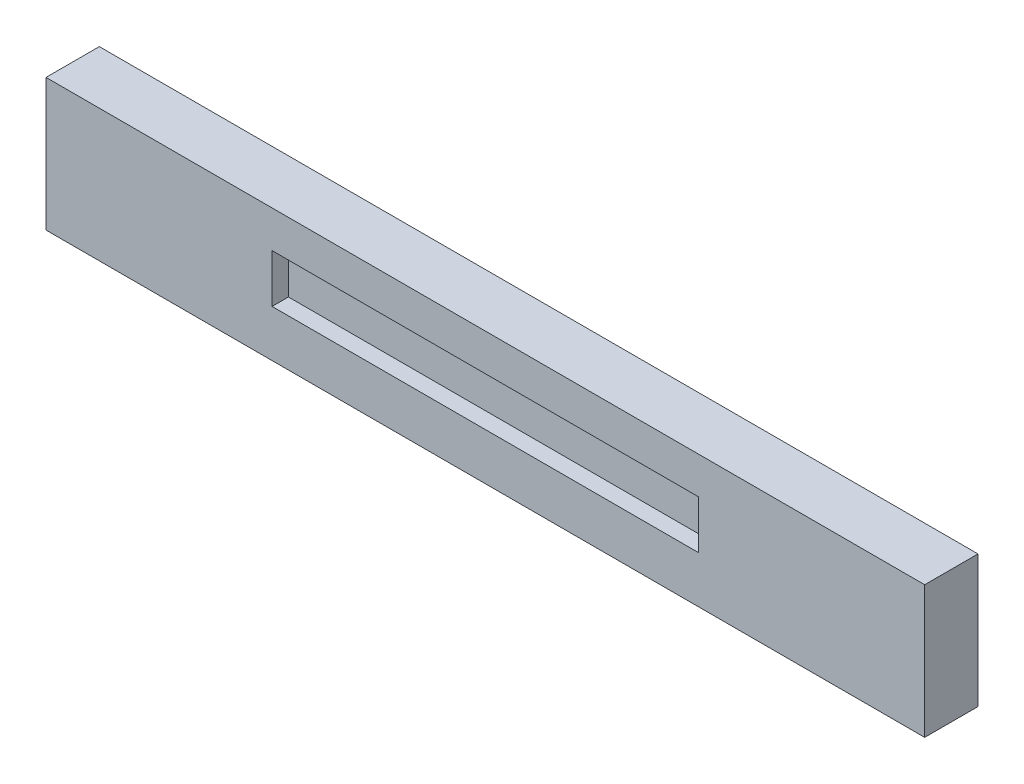
ISO-10303-21;
HEADER;
FILE_DESCRIPTION(('STEP AP214'),'2;1');
FILE_NAME('part.step','',(''),(''),'','','');
FILE_SCHEMA(('AUTOMOTIVE_DESIGN { 1 0 10303 214 1 1 1 1 }'));
ENDSEC;
DATA;
#1=APPLICATION_CONTEXT('core data for automotive mechanical design processes');
#2=APPLICATION_PROTOCOL_DEFINITION('international standard','automotive_design',2000,#1);
#3=PRODUCT_CONTEXT('',#1,'mechanical');
#4=PRODUCT('Part','Part','',(#3));
#5=PRODUCT_RELATED_PRODUCT_CATEGORY('part','',(#4));
#6=PRODUCT_DEFINITION_FORMATION('','',#4);
#7=PRODUCT_DEFINITION_CONTEXT('part definition',#1,'design');
#8=PRODUCT_DEFINITION('design','',#6,#7);
#9=PRODUCT_DEFINITION_SHAPE('','',#8);
#10=(LENGTH_UNIT() NAMED_UNIT(*) SI_UNIT(.MILLI.,.METRE.));
#11=(NAMED_UNIT(*) PLANE_ANGLE_UNIT() SI_UNIT($,.RADIAN.));
#12=(NAMED_UNIT(*) SI_UNIT($,.STERADIAN.) SOLID_ANGLE_UNIT());
#13=UNCERTAINTY_MEASURE_WITH_UNIT(LENGTH_MEASURE(1.E-05),#10,'distance_accuracy_value','');
#14=(GEOMETRIC_REPRESENTATION_CONTEXT(3) GLOBAL_UNCERTAINTY_ASSIGNED_CONTEXT((#13)) GLOBAL_UNIT_ASSIGNED_CONTEXT((#10,
#11,#12)) REPRESENTATION_CONTEXT('',''));
#15=CARTESIAN_POINT('',(0.,0.,0.));
#16=DIRECTION('',(0.,0.,1.));
#17=DIRECTION('',(1.,0.,0.));
#18=AXIS2_PLACEMENT_3D('',#15,#16,#17);
#19=CARTESIAN_POINT('',(0.,0.,38.5));
#20=DIRECTION('',(0.,0.,-1.));
#21=DIRECTION('',(-1.,0.,0.));
#22=AXIS2_PLACEMENT_3D('',#19,#20,#21);
#23=PLANE('',#22);
#24=DIRECTION('',(0.,-1.,0.));
#25=VECTOR('',#24,1.);
#26=CARTESIAN_POINT('',(0.,0.,38.5));
#27=LINE('',#26,#25);
#28=CARTESIAN_POINT('',(0.,93.,38.5));
#29=VERTEX_POINT('',#28);
#30=CARTESIAN_POINT('',(0.,0.,38.5));
#31=VERTEX_POINT('',#30);
#32=EDGE_CURVE('E145',#29,#31,#27,.T.);
#33=ORIENTED_EDGE('',*,*,#32,.T.);
#34=DIRECTION('',(1.,0.,0.));
#35=VECTOR('',#34,1.);
#36=CARTESIAN_POINT('',(0.,0.,38.5));
#37=LINE('',#36,#35);
#38=CARTESIAN_POINT('',(618.,0.,38.5));
#39=VERTEX_POINT('',#38);
#40=EDGE_CURVE('E92',#31,#39,#37,.T.);
#41=ORIENTED_EDGE('',*,*,#40,.T.);
#42=DIRECTION('',(0.,1.,0.));
#43=VECTOR('',#42,1.);
#44=CARTESIAN_POINT('',(618.,0.,38.5));
#45=LINE('',#44,#43);
#46=CARTESIAN_POINT('',(618.,93.,38.5));
#47=VERTEX_POINT('',#46);
#48=EDGE_CURVE('E148',#39,#47,#45,.T.);
#49=ORIENTED_EDGE('',*,*,#48,.T.);
#50=DIRECTION('',(-1.,0.,0.));
#51=VECTOR('',#50,1.);
#52=CARTESIAN_POINT('',(0.,93.,38.5));
#53=LINE('',#52,#51);
#54=EDGE_CURVE('E63',#47,#29,#53,.T.);
#55=ORIENTED_EDGE('',*,*,#54,.T.);
#56=EDGE_LOOP('',(#33,#41,#49,#55));
#57=FACE_BOUND('',#56,.T.);
#58=DIRECTION('',(0.,-1.,0.));
#59=VECTOR('',#58,1.);
#60=CARTESIAN_POINT('',(159.,0.,38.5));
#61=LINE('',#60,#59);
#62=CARTESIAN_POINT('',(159.,67.,38.5));
#63=VERTEX_POINT('',#62);
#64=CARTESIAN_POINT('',(159.,33.,38.5));
#65=VERTEX_POINT('',#64);
#66=EDGE_CURVE('E11',#63,#65,#61,.T.);
#67=ORIENTED_EDGE('',*,*,#66,.F.);
#68=DIRECTION('',(-1.,0.,0.));
#69=VECTOR('',#68,1.);
#70=CARTESIAN_POINT('',(0.,67.,38.5));
#71=LINE('',#70,#69);
#72=CARTESIAN_POINT('',(459.,67.,38.5));
#73=VERTEX_POINT('',#72);
#74=EDGE_CURVE('E167',#73,#63,#71,.T.);
#75=ORIENTED_EDGE('',*,*,#74,.F.);
#76=DIRECTION('',(0.,1.,0.));
#77=VECTOR('',#76,1.);
#78=CARTESIAN_POINT('',(459.,0.,38.5));
#79=LINE('',#78,#77);
#80=CARTESIAN_POINT('',(459.,33.,38.5));
#81=VERTEX_POINT('',#80);
#82=EDGE_CURVE('E169',#81,#73,#79,.T.);
#83=ORIENTED_EDGE('',*,*,#82,.F.);
#84=DIRECTION('',(1.,0.,0.));
#85=VECTOR('',#84,1.);
#86=CARTESIAN_POINT('',(0.,33.,38.5));
#87=LINE('',#86,#85);
#88=EDGE_CURVE('E47',#65,#81,#87,.T.);
#89=ORIENTED_EDGE('',*,*,#88,.F.);
#90=EDGE_LOOP('',(#67,#75,#83,#89));
#91=FACE_BOUND('',#90,.T.);
#92=ADVANCED_FACE('F39',(#57,#91),#23,.F.);
#93=CARTESIAN_POINT('',(0.,0.,38.5));
#94=DIRECTION('',(1.,0.,0.));
#95=DIRECTION('',(0.,0.,-1.));
#96=AXIS2_PLACEMENT_3D('',#93,#94,#95);
#97=PLANE('',#96);
#98=DIRECTION('',(0.,-1.,0.));
#99=VECTOR('',#98,1.);
#100=CARTESIAN_POINT('',(0.,0.,1.));
#101=LINE('',#100,#99);
#102=CARTESIAN_POINT('',(0.,93.,1.));
#103=VERTEX_POINT('',#102);
#104=CARTESIAN_POINT('',(0.,0.,1.));
#105=VERTEX_POINT('',#104);
#106=EDGE_CURVE('E122',#103,#105,#101,.T.);
#107=ORIENTED_EDGE('',*,*,#106,.T.);
#108=DIRECTION('',(0.,0.,-1.));
#109=VECTOR('',#108,1.);
#110=CARTESIAN_POINT('',(0.,0.,38.5));
#111=LINE('',#110,#109);
#112=EDGE_CURVE('E165',#31,#105,#111,.T.);
#113=ORIENTED_EDGE('',*,*,#112,.F.);
#114=ORIENTED_EDGE('',*,*,#32,.F.);
#115=DIRECTION('',(0.,0.,-1.));
#116=VECTOR('',#115,1.);
#117=CARTESIAN_POINT('',(0.,93.,38.5));
#118=LINE('',#117,#116);
#119=EDGE_CURVE('E151',#29,#103,#118,.T.);
#120=ORIENTED_EDGE('',*,*,#119,.T.);
#121=EDGE_LOOP('',(#107,#113,#114,#120));
#122=FACE_BOUND('',#121,.T.);
#123=ADVANCED_FACE('F41',(#122),#97,.F.);
#124=CARTESIAN_POINT('',(0.,0.,38.5));
#125=DIRECTION('',(0.,1.,0.));
#126=DIRECTION('',(0.,0.,1.));
#127=AXIS2_PLACEMENT_3D('',#124,#125,#126);
#128=PLANE('',#127);
#129=DIRECTION('',(1.,0.,0.));
#130=VECTOR('',#129,1.);
#131=CARTESIAN_POINT('',(0.,0.,1.));
#132=LINE('',#131,#130);
#133=CARTESIAN_POINT('',(618.,0.,1.));
#134=VERTEX_POINT('',#133);
#135=EDGE_CURVE('E154',#105,#134,#132,.T.);
#136=ORIENTED_EDGE('',*,*,#135,.T.);
#137=DIRECTION('',(0.,0.,-1.));
#138=VECTOR('',#137,1.);
#139=CARTESIAN_POINT('',(618.,0.,38.5));
#140=LINE('',#139,#138);
#141=EDGE_CURVE('E162',#39,#134,#140,.T.);
#142=ORIENTED_EDGE('',*,*,#141,.F.);
#143=ORIENTED_EDGE('',*,*,#40,.F.);
#144=ORIENTED_EDGE('',*,*,#112,.T.);
#145=EDGE_LOOP('',(#136,#142,#143,#144));
#146=FACE_BOUND('',#145,.T.);
#147=ADVANCED_FACE('F191',(#146),#128,.F.);
#148=CARTESIAN_POINT('',(618.,0.,38.5));
#149=DIRECTION('',(-1.,0.,0.));
#150=DIRECTION('',(0.,0.,1.));
#151=AXIS2_PLACEMENT_3D('',#148,#149,#150);
#152=PLANE('',#151);
#153=DIRECTION('',(0.,1.,0.));
#154=VECTOR('',#153,1.);
#155=CARTESIAN_POINT('',(618.,0.,1.));
#156=LINE('',#155,#154);
#157=CARTESIAN_POINT('',(618.,93.,1.));
#158=VERTEX_POINT('',#157);
#159=EDGE_CURVE('E156',#134,#158,#156,.T.);
#160=ORIENTED_EDGE('',*,*,#159,.T.);
#161=DIRECTION('',(0.,0.,-1.));
#162=VECTOR('',#161,1.);
#163=CARTESIAN_POINT('',(618.,93.,38.5));
#164=LINE('',#163,#162);
#165=EDGE_CURVE('E160',#47,#158,#164,.T.);
#166=ORIENTED_EDGE('',*,*,#165,.F.);
#167=ORIENTED_EDGE('',*,*,#48,.F.);
#168=ORIENTED_EDGE('',*,*,#141,.T.);
#169=EDGE_LOOP('',(#160,#166,#167,#168));
#170=FACE_BOUND('',#169,.T.);
#171=ADVANCED_FACE('F202',(#170),#152,.F.);
#172=CARTESIAN_POINT('',(0.,93.,38.5));
#173=DIRECTION('',(0.,-1.,0.));
#174=DIRECTION('',(0.,0.,-1.));
#175=AXIS2_PLACEMENT_3D('',#172,#173,#174);
#176=PLANE('',#175);
#177=DIRECTION('',(-1.,0.,0.));
#178=VECTOR('',#177,1.);
#179=CARTESIAN_POINT('',(0.,93.,1.));
#180=LINE('',#179,#178);
#181=EDGE_CURVE('E84',#158,#103,#180,.T.);
#182=ORIENTED_EDGE('',*,*,#181,.T.);
#183=ORIENTED_EDGE('',*,*,#119,.F.);
#184=ORIENTED_EDGE('',*,*,#54,.F.);
#185=ORIENTED_EDGE('',*,*,#165,.T.);
#186=EDGE_LOOP('',(#182,#183,#184,#185));
#187=FACE_BOUND('',#186,.T.);
#188=ADVANCED_FACE('F198',(#187),#176,.F.);
#189=CARTESIAN_POINT('',(0.,0.,1.));
#190=DIRECTION('',(0.,0.,-1.));
#191=DIRECTION('',(-1.,0.,0.));
#192=AXIS2_PLACEMENT_3D('',#189,#190,#191);
#193=PLANE('',#192);
#194=ORIENTED_EDGE('',*,*,#106,.F.);
#195=ORIENTED_EDGE('',*,*,#181,.F.);
#196=ORIENTED_EDGE('',*,*,#159,.F.);
#197=ORIENTED_EDGE('',*,*,#135,.F.);
#198=EDGE_LOOP('',(#194,#195,#196,#197));
#199=FACE_BOUND('',#198,.T.);
#200=ADVANCED_FACE('F196',(#199),#193,.T.);
#201=CARTESIAN_POINT('',(159.,33.,41.));
#202=DIRECTION('',(1.,0.,0.));
#203=DIRECTION('',(0.,0.,-1.));
#204=AXIS2_PLACEMENT_3D('',#201,#202,#203);
#205=PLANE('',#204);
#206=ORIENTED_EDGE('',*,*,#66,.T.);
#207=DIRECTION('',(0.,0.,-1.));
#208=VECTOR('',#207,1.);
#209=CARTESIAN_POINT('',(159.,33.,41.));
#210=LINE('',#209,#208);
#211=CARTESIAN_POINT('',(159.,33.,27.));
#212=VERTEX_POINT('',#211);
#213=EDGE_CURVE('E113',#65,#212,#210,.T.);
#214=ORIENTED_EDGE('',*,*,#213,.T.);
#215=DIRECTION('',(0.,-1.,0.));
#216=VECTOR('',#215,1.);
#217=CARTESIAN_POINT('',(159.,33.,27.));
#218=LINE('',#217,#216);
#219=CARTESIAN_POINT('',(159.,67.,27.));
#220=VERTEX_POINT('',#219);
#221=EDGE_CURVE('E118',#220,#212,#218,.T.);
#222=ORIENTED_EDGE('',*,*,#221,.F.);
#223=DIRECTION('',(0.,0.,-1.));
#224=VECTOR('',#223,1.);
#225=CARTESIAN_POINT('',(159.,67.,41.));
#226=LINE('',#225,#224);
#227=EDGE_CURVE('E141',#63,#220,#226,.T.);
#228=ORIENTED_EDGE('',*,*,#227,.F.);
#229=EDGE_LOOP('',(#206,#214,#222,#228));
#230=FACE_BOUND('',#229,.T.);
#231=ADVANCED_FACE('F115',(#230),#205,.T.);
#232=CARTESIAN_POINT('',(159.,33.,41.));
#233=DIRECTION('',(0.,1.,0.));
#234=DIRECTION('',(0.,0.,1.));
#235=AXIS2_PLACEMENT_3D('',#232,#233,#234);
#236=PLANE('',#235);
#237=ORIENTED_EDGE('',*,*,#88,.T.);
#238=DIRECTION('',(0.,0.,-1.));
#239=VECTOR('',#238,1.);
#240=CARTESIAN_POINT('',(459.,33.,41.));
#241=LINE('',#240,#239);
#242=CARTESIAN_POINT('',(459.,33.,27.));
#243=VERTEX_POINT('',#242);
#244=EDGE_CURVE('E123',#81,#243,#241,.T.);
#245=ORIENTED_EDGE('',*,*,#244,.T.);
#246=DIRECTION('',(1.,0.,0.));
#247=VECTOR('',#246,1.);
#248=CARTESIAN_POINT('',(159.,33.,27.));
#249=LINE('',#248,#247);
#250=EDGE_CURVE('E126',#212,#243,#249,.T.);
#251=ORIENTED_EDGE('',*,*,#250,.F.);
#252=ORIENTED_EDGE('',*,*,#213,.F.);
#253=EDGE_LOOP('',(#237,#245,#251,#252));
#254=FACE_BOUND('',#253,.T.);
#255=ADVANCED_FACE('F127',(#254),#236,.T.);
#256=CARTESIAN_POINT('',(459.,33.,41.));
#257=DIRECTION('',(-1.,0.,0.));
#258=DIRECTION('',(0.,0.,1.));
#259=AXIS2_PLACEMENT_3D('',#256,#257,#258);
#260=PLANE('',#259);
#261=ORIENTED_EDGE('',*,*,#82,.T.);
#262=DIRECTION('',(0.,0.,-1.));
#263=VECTOR('',#262,1.);
#264=CARTESIAN_POINT('',(459.,67.,41.));
#265=LINE('',#264,#263);
#266=CARTESIAN_POINT('',(459.,67.,27.));
#267=VERTEX_POINT('',#266);
#268=EDGE_CURVE('E54',#73,#267,#265,.T.);
#269=ORIENTED_EDGE('',*,*,#268,.T.);
#270=DIRECTION('',(0.,1.,0.));
#271=VECTOR('',#270,1.);
#272=CARTESIAN_POINT('',(459.,33.,27.));
#273=LINE('',#272,#271);
#274=EDGE_CURVE('E132',#243,#267,#273,.T.);
#275=ORIENTED_EDGE('',*,*,#274,.F.);
#276=ORIENTED_EDGE('',*,*,#244,.F.);
#277=EDGE_LOOP('',(#261,#269,#275,#276));
#278=FACE_BOUND('',#277,.T.);
#279=ADVANCED_FACE('F173',(#278),#260,.T.);
#280=CARTESIAN_POINT('',(159.,67.,41.));
#281=DIRECTION('',(0.,-1.,0.));
#282=DIRECTION('',(0.,0.,-1.));
#283=AXIS2_PLACEMENT_3D('',#280,#281,#282);
#284=PLANE('',#283);
#285=ORIENTED_EDGE('',*,*,#74,.T.);
#286=ORIENTED_EDGE('',*,*,#227,.T.);
#287=DIRECTION('',(-1.,0.,0.));
#288=VECTOR('',#287,1.);
#289=CARTESIAN_POINT('',(159.,67.,27.));
#290=LINE('',#289,#288);
#291=EDGE_CURVE('E136',#267,#220,#290,.T.);
#292=ORIENTED_EDGE('',*,*,#291,.F.);
#293=ORIENTED_EDGE('',*,*,#268,.F.);
#294=EDGE_LOOP('',(#285,#286,#292,#293));
#295=FACE_BOUND('',#294,.T.);
#296=ADVANCED_FACE('F175',(#295),#284,.T.);
#297=CARTESIAN_POINT('',(0.,0.,27.));
#298=DIRECTION('',(0.,0.,-1.));
#299=DIRECTION('',(-1.,0.,0.));
#300=AXIS2_PLACEMENT_3D('',#297,#298,#299);
#301=PLANE('',#300);
#302=ORIENTED_EDGE('',*,*,#221,.T.);
#303=ORIENTED_EDGE('',*,*,#250,.T.);
#304=ORIENTED_EDGE('',*,*,#274,.T.);
#305=ORIENTED_EDGE('',*,*,#291,.T.);
#306=EDGE_LOOP('',(#302,#303,#304,#305));
#307=FACE_BOUND('',#306,.T.);
#308=ADVANCED_FACE('F135',(#307),#301,.F.);
#309=CLOSED_SHELL('',(#92,#123,#147,#171,#188,#200,#231,#255,#279,#296,#308));
#310=MANIFOLD_SOLID_BREP('B2',#309);
#311=ADVANCED_BREP_SHAPE_REPRESENTATION('',(#18,#310),#14);
#312=SHAPE_DEFINITION_REPRESENTATION(#9,#311);
ENDSEC;
END-ISO-10303-21;
